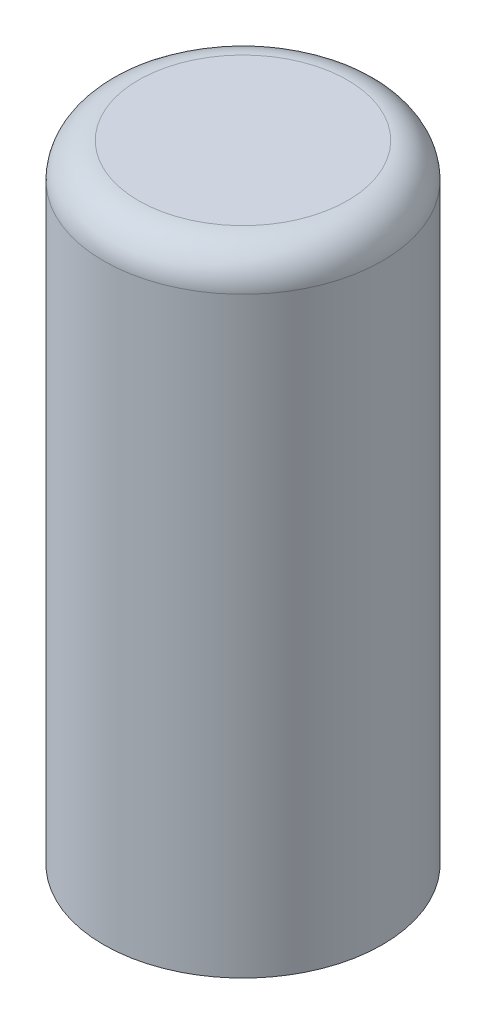
ISO-10303-21;
HEADER;
FILE_DESCRIPTION(('STEP AP214'),'2;1');
FILE_NAME('part.step','',(''),(''),'','','');
FILE_SCHEMA(('AUTOMOTIVE_DESIGN { 1 0 10303 214 1 1 1 1 }'));
ENDSEC;
DATA;
#1=APPLICATION_CONTEXT('core data for automotive mechanical design processes');
#2=APPLICATION_PROTOCOL_DEFINITION('international standard','automotive_design',2000,#1);
#3=PRODUCT_CONTEXT('',#1,'mechanical');
#4=PRODUCT('Part','Part','',(#3));
#5=PRODUCT_RELATED_PRODUCT_CATEGORY('part','',(#4));
#6=PRODUCT_DEFINITION_FORMATION('','',#4);
#7=PRODUCT_DEFINITION_CONTEXT('part definition',#1,'design');
#8=PRODUCT_DEFINITION('design','',#6,#7);
#9=PRODUCT_DEFINITION_SHAPE('','',#8);
#10=(LENGTH_UNIT() NAMED_UNIT(*) SI_UNIT(.MILLI.,.METRE.));
#11=(NAMED_UNIT(*) PLANE_ANGLE_UNIT() SI_UNIT($,.RADIAN.));
#12=(NAMED_UNIT(*) SI_UNIT($,.STERADIAN.) SOLID_ANGLE_UNIT());
#13=UNCERTAINTY_MEASURE_WITH_UNIT(LENGTH_MEASURE(1.E-05),#10,'distance_accuracy_value','');
#14=(GEOMETRIC_REPRESENTATION_CONTEXT(3) GLOBAL_UNCERTAINTY_ASSIGNED_CONTEXT((#13)) GLOBAL_UNIT_ASSIGNED_CONTEXT((#10,
#11,#12)) REPRESENTATION_CONTEXT('',''));
#15=CARTESIAN_POINT('',(0.,0.,0.));
#16=DIRECTION('',(0.,0.,1.));
#17=DIRECTION('',(1.,0.,0.));
#18=AXIS2_PLACEMENT_3D('',#15,#16,#17);
#19=CARTESIAN_POINT('',(0.,9.,0.));
#20=DIRECTION('',(0.,1.,0.));
#21=DIRECTION('',(0.,0.,1.));
#22=AXIS2_PLACEMENT_3D('',#19,#20,#21);
#23=TOROIDAL_SURFACE('',#22,3.,1.);
#24=CARTESIAN_POINT('',(0.,10.,0.));
#25=DIRECTION('',(0.,1.,0.));
#26=DIRECTION('',(0.,0.,1.));
#27=AXIS2_PLACEMENT_3D('',#24,#25,#26);
#28=CIRCLE('',#27,3.);
#29=CARTESIAN_POINT('',(0.,10.,3.));
#30=VERTEX_POINT('',#29);
#31=EDGE_CURVE('E46',#30,#30,#28,.T.);
#32=ORIENTED_EDGE('',*,*,#31,.F.);
#33=EDGE_LOOP('',(#32));
#34=FACE_BOUND('',#33,.T.);
#35=CARTESIAN_POINT('',(0.,9.,0.));
#36=DIRECTION('',(0.,1.,0.));
#37=DIRECTION('',(0.,0.,1.));
#38=AXIS2_PLACEMENT_3D('',#35,#36,#37);
#39=CIRCLE('',#38,4.);
#40=CARTESIAN_POINT('',(0.,9.,4.));
#41=VERTEX_POINT('',#40);
#42=EDGE_CURVE('E11',#41,#41,#39,.F.);
#43=ORIENTED_EDGE('',*,*,#42,.F.);
#44=EDGE_LOOP('',(#43));
#45=FACE_BOUND('',#44,.T.);
#46=ADVANCED_FACE('F39',(#34,#45),#23,.T.);
#47=CARTESIAN_POINT('',(0.,10.,0.));
#48=DIRECTION('',(0.,-1.,0.));
#49=DIRECTION('',(0.,0.,-1.));
#50=AXIS2_PLACEMENT_3D('',#47,#48,#49);
#51=CYLINDRICAL_SURFACE('',#50,4.);
#52=ORIENTED_EDGE('',*,*,#42,.T.);
#53=EDGE_LOOP('',(#52));
#54=FACE_BOUND('',#53,.T.);
#55=CARTESIAN_POINT('',(0.,-8.,0.));
#56=DIRECTION('',(0.,-1.,0.));
#57=DIRECTION('',(0.,0.,-1.));
#58=AXIS2_PLACEMENT_3D('',#55,#56,#57);
#59=CIRCLE('',#58,4.);
#60=CARTESIAN_POINT('',(0.,-8.,-4.));
#61=VERTEX_POINT('',#60);
#62=EDGE_CURVE('E114',#61,#61,#59,.T.);
#63=ORIENTED_EDGE('',*,*,#62,.F.);
#64=EDGE_LOOP('',(#63));
#65=FACE_BOUND('',#64,.T.);
#66=ADVANCED_FACE('F123',(#54,#65),#51,.T.);
#67=CARTESIAN_POINT('',(0.,10.,0.));
#68=DIRECTION('',(0.,1.,0.));
#69=DIRECTION('',(0.,0.,1.));
#70=AXIS2_PLACEMENT_3D('',#67,#68,#69);
#71=PLANE('',#70);
#72=ORIENTED_EDGE('',*,*,#31,.T.);
#73=EDGE_LOOP('',(#72));
#74=FACE_BOUND('',#73,.T.);
#75=ADVANCED_FACE('F119',(#74),#71,.T.);
#76=CARTESIAN_POINT('',(0.,-8.,0.));
#77=DIRECTION('',(0.,-1.,0.));
#78=DIRECTION('',(0.,0.,-1.));
#79=AXIS2_PLACEMENT_3D('',#76,#77,#78);
#80=PLANE('',#79);
#81=ORIENTED_EDGE('',*,*,#62,.T.);
#82=EDGE_LOOP('',(#81));
#83=FACE_BOUND('',#82,.T.);
#84=DIRECTION('',(-1.,0.,0.));
#85=VECTOR('',#84,1.);
#86=CARTESIAN_POINT('',(-3.03407728972088,-8.,-0.5));
#87=LINE('',#86,#85);
#88=CARTESIAN_POINT('',(3.03407728972088,-8.,-0.499999999999998));
#89=VERTEX_POINT('',#88);
#90=CARTESIAN_POINT('',(-3.03407728972088,-8.,-0.5));
#91=VERTEX_POINT('',#90);
#92=EDGE_CURVE('E103',#89,#91,#87,.T.);
#93=ORIENTED_EDGE('',*,*,#92,.F.);
#94=CARTESIAN_POINT('',(0.,-8.,0.));
#95=DIRECTION('',(0.,-1.,0.));
#96=DIRECTION('',(0.,0.,-1.));
#97=AXIS2_PLACEMENT_3D('',#94,#95,#96);
#98=CIRCLE('',#97,3.075);
#99=EDGE_CURVE('E100',#91,#89,#98,.T.);
#100=ORIENTED_EDGE('',*,*,#99,.F.);
#101=EDGE_LOOP('',(#93,#100));
#102=FACE_BOUND('',#101,.T.);
#103=DIRECTION('',(1.,0.,0.));
#104=VECTOR('',#103,1.);
#105=CARTESIAN_POINT('',(-3.03407728972088,-8.,0.499999999999999));
#106=LINE('',#105,#104);
#107=CARTESIAN_POINT('',(-3.03407728972088,-8.,0.499999999999999));
#108=VERTEX_POINT('',#107);
#109=CARTESIAN_POINT('',(3.03407728972088,-8.,0.499999999999999));
#110=VERTEX_POINT('',#109);
#111=EDGE_CURVE('E77',#108,#110,#106,.T.);
#112=ORIENTED_EDGE('',*,*,#111,.F.);
#113=CARTESIAN_POINT('',(0.,-8.,0.));
#114=DIRECTION('',(0.,-1.,0.));
#115=DIRECTION('',(0.,0.,-1.));
#116=AXIS2_PLACEMENT_3D('',#113,#114,#115);
#117=CIRCLE('',#116,3.075);
#118=EDGE_CURVE('E84',#110,#108,#117,.T.);
#119=ORIENTED_EDGE('',*,*,#118,.F.);
#120=EDGE_LOOP('',(#112,#119));
#121=FACE_BOUND('',#120,.T.);
#122=ADVANCED_FACE('F92',(#83,#102,#121),#80,.T.);
#123=CARTESIAN_POINT('',(0.,-8.,0.));
#124=DIRECTION('',(0.,1.,0.));
#125=DIRECTION('',(0.,0.,1.));
#126=AXIS2_PLACEMENT_3D('',#123,#124,#125);
#127=CYLINDRICAL_SURFACE('',#126,3.075);
#128=CARTESIAN_POINT('',(0.,0.,0.));
#129=DIRECTION('',(0.,-1.,0.));
#130=DIRECTION('',(0.,0.,-1.));
#131=AXIS2_PLACEMENT_3D('',#128,#129,#130);
#132=CIRCLE('',#131,3.075);
#133=CARTESIAN_POINT('',(-3.03407728972088,0.,-0.5));
#134=VERTEX_POINT('',#133);
#135=CARTESIAN_POINT('',(3.03407728972088,0.,-0.499999999999998));
#136=VERTEX_POINT('',#135);
#137=EDGE_CURVE('E99',#134,#136,#132,.T.);
#138=ORIENTED_EDGE('',*,*,#137,.F.);
#139=DIRECTION('',(0.,1.,0.));
#140=VECTOR('',#139,1.);
#141=CARTESIAN_POINT('',(-3.03407728972088,-8.,-0.5));
#142=LINE('',#141,#140);
#143=EDGE_CURVE('E53',#91,#134,#142,.T.);
#144=ORIENTED_EDGE('',*,*,#143,.F.);
#145=ORIENTED_EDGE('',*,*,#99,.T.);
#146=DIRECTION('',(0.,1.,0.));
#147=VECTOR('',#146,1.);
#148=CARTESIAN_POINT('',(3.03407728972088,-8.,-0.499999999999998));
#149=LINE('',#148,#147);
#150=EDGE_CURVE('E111',#89,#136,#149,.T.);
#151=ORIENTED_EDGE('',*,*,#150,.T.);
#152=EDGE_LOOP('',(#138,#144,#145,#151));
#153=FACE_BOUND('',#152,.T.);
#154=ADVANCED_FACE('F132',(#153),#127,.F.);
#155=CARTESIAN_POINT('',(-3.03407728972088,-8.,-0.5));
#156=DIRECTION('',(0.,0.,-1.));
#157=DIRECTION('',(-1.,0.,0.));
#158=AXIS2_PLACEMENT_3D('',#155,#156,#157);
#159=PLANE('',#158);
#160=DIRECTION('',(-1.,0.,0.));
#161=VECTOR('',#160,1.);
#162=CARTESIAN_POINT('',(-3.03407728972088,0.,-0.5));
#163=LINE('',#162,#161);
#164=EDGE_CURVE('E104',#136,#134,#163,.T.);
#165=ORIENTED_EDGE('',*,*,#164,.F.);
#166=ORIENTED_EDGE('',*,*,#150,.F.);
#167=ORIENTED_EDGE('',*,*,#92,.T.);
#168=ORIENTED_EDGE('',*,*,#143,.T.);
#169=EDGE_LOOP('',(#165,#166,#167,#168));
#170=FACE_BOUND('',#169,.T.);
#171=ADVANCED_FACE('F136',(#170),#159,.T.);
#172=CARTESIAN_POINT('',(0.,-8.,0.));
#173=DIRECTION('',(0.,1.,0.));
#174=DIRECTION('',(0.,0.,1.));
#175=AXIS2_PLACEMENT_3D('',#172,#173,#174);
#176=CYLINDRICAL_SURFACE('',#175,3.075);
#177=CARTESIAN_POINT('',(0.,0.,0.));
#178=DIRECTION('',(0.,-1.,0.));
#179=DIRECTION('',(0.,0.,-1.));
#180=AXIS2_PLACEMENT_3D('',#177,#178,#179);
#181=CIRCLE('',#180,3.075);
#182=CARTESIAN_POINT('',(3.03407728972088,0.,0.499999999999999));
#183=VERTEX_POINT('',#182);
#184=CARTESIAN_POINT('',(-3.03407728972088,0.,0.499999999999999));
#185=VERTEX_POINT('',#184);
#186=EDGE_CURVE('E89',#183,#185,#181,.T.);
#187=ORIENTED_EDGE('',*,*,#186,.F.);
#188=DIRECTION('',(0.,1.,0.));
#189=VECTOR('',#188,1.);
#190=CARTESIAN_POINT('',(3.03407728972088,-8.,0.499999999999999));
#191=LINE('',#190,#189);
#192=EDGE_CURVE('E61',#110,#183,#191,.T.);
#193=ORIENTED_EDGE('',*,*,#192,.F.);
#194=ORIENTED_EDGE('',*,*,#118,.T.);
#195=DIRECTION('',(0.,1.,0.));
#196=VECTOR('',#195,1.);
#197=CARTESIAN_POINT('',(-3.03407728972088,-8.,0.499999999999999));
#198=LINE('',#197,#196);
#199=EDGE_CURVE('E80',#108,#185,#198,.T.);
#200=ORIENTED_EDGE('',*,*,#199,.T.);
#201=EDGE_LOOP('',(#187,#193,#194,#200));
#202=FACE_BOUND('',#201,.T.);
#203=ADVANCED_FACE('F87',(#202),#176,.F.);
#204=CARTESIAN_POINT('',(-3.03407728972088,-8.,0.499999999999999));
#205=DIRECTION('',(0.,0.,1.));
#206=DIRECTION('',(1.,0.,0.));
#207=AXIS2_PLACEMENT_3D('',#204,#205,#206);
#208=PLANE('',#207);
#209=DIRECTION('',(1.,0.,0.));
#210=VECTOR('',#209,1.);
#211=CARTESIAN_POINT('',(-3.03407728972088,0.,0.499999999999999));
#212=LINE('',#211,#210);
#213=EDGE_CURVE('E93',#185,#183,#212,.T.);
#214=ORIENTED_EDGE('',*,*,#213,.F.);
#215=ORIENTED_EDGE('',*,*,#199,.F.);
#216=ORIENTED_EDGE('',*,*,#111,.T.);
#217=ORIENTED_EDGE('',*,*,#192,.T.);
#218=EDGE_LOOP('',(#214,#215,#216,#217));
#219=FACE_BOUND('',#218,.T.);
#220=ADVANCED_FACE('F78',(#219),#208,.T.);
#221=CARTESIAN_POINT('',(0.,0.,0.));
#222=DIRECTION('',(0.,1.,0.));
#223=DIRECTION('',(0.,0.,1.));
#224=AXIS2_PLACEMENT_3D('',#221,#222,#223);
#225=PLANE('',#224);
#226=ORIENTED_EDGE('',*,*,#164,.T.);
#227=ORIENTED_EDGE('',*,*,#137,.T.);
#228=EDGE_LOOP('',(#226,#227));
#229=FACE_BOUND('',#228,.T.);
#230=ADVANCED_FACE('F139',(#229),#225,.F.);
#231=ORIENTED_EDGE('',*,*,#213,.T.);
#232=ORIENTED_EDGE('',*,*,#186,.T.);
#233=EDGE_LOOP('',(#231,#232));
#234=FACE_BOUND('',#233,.T.);
#235=ADVANCED_FACE('F141',(#234),#225,.F.);
#236=CLOSED_SHELL('',(#46,#66,#75,#122,#154,#171,#203,#220,#230,#235));
#237=MANIFOLD_SOLID_BREP('B2',#236);
#238=ADVANCED_BREP_SHAPE_REPRESENTATION('',(#18,#237),#14);
#239=SHAPE_DEFINITION_REPRESENTATION(#9,#238);
ENDSEC;
END-ISO-10303-21;
